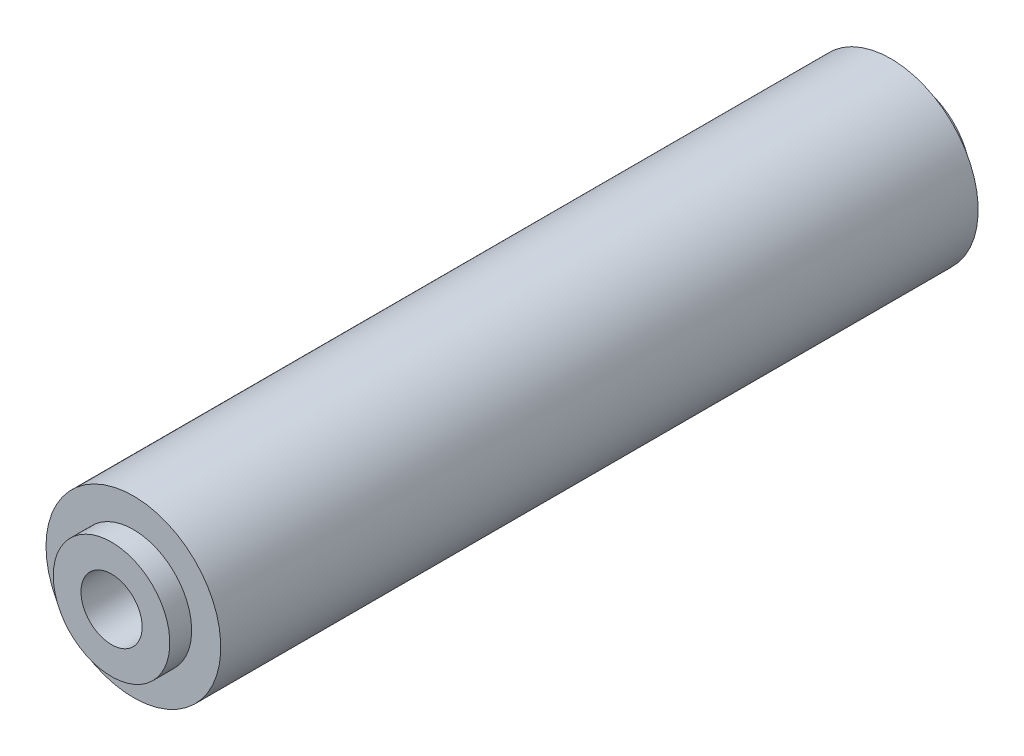
ISO-10303-21;
HEADER;
FILE_DESCRIPTION(('STEP AP214'),'2;1');
FILE_NAME('part.step','',(''),(''),'','','');
FILE_SCHEMA(('AUTOMOTIVE_DESIGN { 1 0 10303 214 1 1 1 1 }'));
ENDSEC;
DATA;
#1=APPLICATION_CONTEXT('core data for automotive mechanical design processes');
#2=APPLICATION_PROTOCOL_DEFINITION('international standard','automotive_design',2000,#1);
#3=PRODUCT_CONTEXT('',#1,'mechanical');
#4=PRODUCT('Part','Part','',(#3));
#5=PRODUCT_RELATED_PRODUCT_CATEGORY('part','',(#4));
#6=PRODUCT_DEFINITION_FORMATION('','',#4);
#7=PRODUCT_DEFINITION_CONTEXT('part definition',#1,'design');
#8=PRODUCT_DEFINITION('design','',#6,#7);
#9=PRODUCT_DEFINITION_SHAPE('','',#8);
#10=(LENGTH_UNIT() NAMED_UNIT(*) SI_UNIT(.MILLI.,.METRE.));
#11=(NAMED_UNIT(*) PLANE_ANGLE_UNIT() SI_UNIT($,.RADIAN.));
#12=(NAMED_UNIT(*) SI_UNIT($,.STERADIAN.) SOLID_ANGLE_UNIT());
#13=UNCERTAINTY_MEASURE_WITH_UNIT(LENGTH_MEASURE(1.E-05),#10,'distance_accuracy_value','');
#14=(GEOMETRIC_REPRESENTATION_CONTEXT(3) GLOBAL_UNCERTAINTY_ASSIGNED_CONTEXT((#13)) GLOBAL_UNIT_ASSIGNED_CONTEXT((#10,
#11,#12)) REPRESENTATION_CONTEXT('',''));
#15=CARTESIAN_POINT('',(0.,0.,0.));
#16=DIRECTION('',(0.,0.,1.));
#17=DIRECTION('',(1.,0.,0.));
#18=AXIS2_PLACEMENT_3D('',#15,#16,#17);
#19=CARTESIAN_POINT('',(0.,94.,-26.));
#20=DIRECTION('',(0.,0.,-1.));
#21=DIRECTION('',(-1.,0.,0.));
#22=AXIS2_PLACEMENT_3D('',#19,#20,#21);
#23=PLANE('',#22);
#24=CARTESIAN_POINT('',(0.,90.,-26.));
#25=DIRECTION('',(0.,0.,-1.));
#26=DIRECTION('',(-1.,0.,0.));
#27=AXIS2_PLACEMENT_3D('',#24,#25,#26);
#28=CIRCLE('',#27,5.99999999999999);
#29=CARTESIAN_POINT('',(-5.99999999999999,90.,-26.));
#30=VERTEX_POINT('',#29);
#31=EDGE_CURVE('E11',#30,#30,#28,.T.);
#32=ORIENTED_EDGE('',*,*,#31,.T.);
#33=EDGE_LOOP('',(#32));
#34=FACE_BOUND('',#33,.T.);
#35=CARTESIAN_POINT('',(0.,90.,-26.));
#36=DIRECTION('',(0.,0.,-1.));
#37=DIRECTION('',(-1.,0.,0.));
#38=AXIS2_PLACEMENT_3D('',#35,#36,#37);
#39=CIRCLE('',#38,4.);
#40=CARTESIAN_POINT('',(-4.,90.,-26.));
#41=VERTEX_POINT('',#40);
#42=EDGE_CURVE('E68',#41,#41,#39,.T.);
#43=ORIENTED_EDGE('',*,*,#42,.F.);
#44=EDGE_LOOP('',(#43));
#45=FACE_BOUND('',#44,.T.);
#46=ADVANCED_FACE('F34',(#34,#45),#23,.T.);
#47=CARTESIAN_POINT('',(0.,90.,-27.5));
#48=DIRECTION('',(0.,0.,-1.));
#49=DIRECTION('',(-1.,0.,0.));
#50=AXIS2_PLACEMENT_3D('',#47,#48,#49);
#51=CYLINDRICAL_SURFACE('',#50,6.00000000000001);
#52=CARTESIAN_POINT('',(0.,90.,26.));
#53=DIRECTION('',(0.,0.,-1.));
#54=DIRECTION('',(-1.,0.,0.));
#55=AXIS2_PLACEMENT_3D('',#52,#53,#54);
#56=CIRCLE('',#55,6.00000000000002);
#57=CARTESIAN_POINT('',(-6.00000000000002,90.,26.));
#58=VERTEX_POINT('',#57);
#59=EDGE_CURVE('E41',#58,#58,#56,.T.);
#60=ORIENTED_EDGE('',*,*,#59,.T.);
#61=EDGE_LOOP('',(#60));
#62=FACE_BOUND('',#61,.T.);
#63=ORIENTED_EDGE('',*,*,#31,.F.);
#64=EDGE_LOOP('',(#63));
#65=FACE_BOUND('',#64,.T.);
#66=ADVANCED_FACE('F82',(#62,#65),#51,.T.);
#67=CARTESIAN_POINT('',(0.,94.,26.));
#68=DIRECTION('',(0.,0.,1.));
#69=DIRECTION('',(1.,0.,0.));
#70=AXIS2_PLACEMENT_3D('',#67,#68,#69);
#71=PLANE('',#70);
#72=CARTESIAN_POINT('',(0.,90.,26.));
#73=DIRECTION('',(0.,0.,-1.));
#74=DIRECTION('',(-1.,0.,0.));
#75=AXIS2_PLACEMENT_3D('',#72,#73,#74);
#76=CIRCLE('',#75,4.);
#77=CARTESIAN_POINT('',(-4.,90.,26.));
#78=VERTEX_POINT('',#77);
#79=EDGE_CURVE('E77',#78,#78,#76,.T.);
#80=ORIENTED_EDGE('',*,*,#79,.T.);
#81=EDGE_LOOP('',(#80));
#82=FACE_BOUND('',#81,.T.);
#83=ORIENTED_EDGE('',*,*,#59,.F.);
#84=EDGE_LOOP('',(#83));
#85=FACE_BOUND('',#84,.T.);
#86=ADVANCED_FACE('F85',(#82,#85),#71,.T.);
#87=CARTESIAN_POINT('',(0.,90.,-27.5));
#88=DIRECTION('',(0.,0.,-1.));
#89=DIRECTION('',(-1.,0.,0.));
#90=AXIS2_PLACEMENT_3D('',#87,#88,#89);
#91=CYLINDRICAL_SURFACE('',#90,4.);
#92=CARTESIAN_POINT('',(0.,90.,27.5));
#93=DIRECTION('',(0.,0.,-1.));
#94=DIRECTION('',(-1.,0.,0.));
#95=AXIS2_PLACEMENT_3D('',#92,#93,#94);
#96=CIRCLE('',#95,4.);
#97=CARTESIAN_POINT('',(-4.,90.,27.5));
#98=VERTEX_POINT('',#97);
#99=EDGE_CURVE('E74',#98,#98,#96,.T.);
#100=ORIENTED_EDGE('',*,*,#99,.T.);
#101=EDGE_LOOP('',(#100));
#102=FACE_BOUND('',#101,.T.);
#103=ORIENTED_EDGE('',*,*,#79,.F.);
#104=EDGE_LOOP('',(#103));
#105=FACE_BOUND('',#104,.T.);
#106=ADVANCED_FACE('F87',(#102,#105),#91,.T.);
#107=CARTESIAN_POINT('',(0.,90.,27.5));
#108=DIRECTION('',(0.,0.,1.));
#109=DIRECTION('',(1.,0.,0.));
#110=AXIS2_PLACEMENT_3D('',#107,#108,#109);
#111=PLANE('',#110);
#112=CARTESIAN_POINT('',(0.,90.,27.5));
#113=DIRECTION('',(0.,0.,1.));
#114=DIRECTION('',(1.,0.,0.));
#115=AXIS2_PLACEMENT_3D('',#112,#113,#114);
#116=CIRCLE('',#115,2.1);
#117=CARTESIAN_POINT('',(2.1,90.,27.5));
#118=VERTEX_POINT('',#117);
#119=EDGE_CURVE('E57',#118,#118,#116,.T.);
#120=ORIENTED_EDGE('',*,*,#119,.F.);
#121=EDGE_LOOP('',(#120));
#122=FACE_BOUND('',#121,.T.);
#123=ORIENTED_EDGE('',*,*,#99,.F.);
#124=EDGE_LOOP('',(#123));
#125=FACE_BOUND('',#124,.T.);
#126=ADVANCED_FACE('F94',(#122,#125),#111,.T.);
#127=CARTESIAN_POINT('',(0.,94.,-27.5));
#128=DIRECTION('',(0.,0.,-1.));
#129=DIRECTION('',(-1.,0.,0.));
#130=AXIS2_PLACEMENT_3D('',#127,#128,#129);
#131=PLANE('',#130);
#132=CARTESIAN_POINT('',(0.,90.,-27.5));
#133=DIRECTION('',(0.,0.,-1.));
#134=DIRECTION('',(-1.,0.,0.));
#135=AXIS2_PLACEMENT_3D('',#132,#133,#134);
#136=CIRCLE('',#135,2.1);
#137=CARTESIAN_POINT('',(-2.1,90.,-27.5));
#138=VERTEX_POINT('',#137);
#139=EDGE_CURVE('E58',#138,#138,#136,.T.);
#140=ORIENTED_EDGE('',*,*,#139,.F.);
#141=EDGE_LOOP('',(#140));
#142=FACE_BOUND('',#141,.T.);
#143=CARTESIAN_POINT('',(0.,90.,-27.5));
#144=DIRECTION('',(0.,0.,-1.));
#145=DIRECTION('',(-1.,0.,0.));
#146=AXIS2_PLACEMENT_3D('',#143,#144,#145);
#147=CIRCLE('',#146,4.);
#148=CARTESIAN_POINT('',(-4.,90.,-27.5));
#149=VERTEX_POINT('',#148);
#150=EDGE_CURVE('E71',#149,#149,#147,.T.);
#151=ORIENTED_EDGE('',*,*,#150,.T.);
#152=EDGE_LOOP('',(#151));
#153=FACE_BOUND('',#152,.T.);
#154=ADVANCED_FACE('F109',(#142,#153),#131,.T.);
#155=CARTESIAN_POINT('',(0.,90.,-27.5));
#156=DIRECTION('',(0.,0.,-1.));
#157=DIRECTION('',(-1.,0.,0.));
#158=AXIS2_PLACEMENT_3D('',#155,#156,#157);
#159=CYLINDRICAL_SURFACE('',#158,4.);
#160=ORIENTED_EDGE('',*,*,#42,.T.);
#161=EDGE_LOOP('',(#160));
#162=FACE_BOUND('',#161,.T.);
#163=ORIENTED_EDGE('',*,*,#150,.F.);
#164=EDGE_LOOP('',(#163));
#165=FACE_BOUND('',#164,.T.);
#166=ADVANCED_FACE('F105',(#162,#165),#159,.T.);
#167=CARTESIAN_POINT('',(0.,90.,12.5));
#168=DIRECTION('',(0.,0.,1.));
#169=DIRECTION('',(1.,0.,0.));
#170=AXIS2_PLACEMENT_3D('',#167,#168,#169);
#171=CONICAL_SURFACE('',#170,2.1,1.02974425867665);
#172=CARTESIAN_POINT('',(0.,90.,11.2381927000421));
#173=VERTEX_POINT('',#172);
#174=VERTEX_LOOP('',#173);
#175=FACE_BOUND('',#174,.T.);
#176=CARTESIAN_POINT('',(0.,90.,12.5));
#177=DIRECTION('',(0.,0.,1.));
#178=DIRECTION('',(1.,0.,0.));
#179=AXIS2_PLACEMENT_3D('',#176,#177,#178);
#180=CIRCLE('',#179,2.1);
#181=CARTESIAN_POINT('',(2.1,90.,12.5));
#182=VERTEX_POINT('',#181);
#183=EDGE_CURVE('E61',#182,#182,#180,.T.);
#184=ORIENTED_EDGE('',*,*,#183,.T.);
#185=EDGE_LOOP('',(#184));
#186=FACE_BOUND('',#185,.T.);
#187=ADVANCED_FACE('F108',(#175,#186),#171,.F.);
#188=CARTESIAN_POINT('',(0.,90.,27.5));
#189=DIRECTION('',(0.,0.,1.));
#190=DIRECTION('',(1.,0.,0.));
#191=AXIS2_PLACEMENT_3D('',#188,#189,#190);
#192=CYLINDRICAL_SURFACE('',#191,2.1);
#193=ORIENTED_EDGE('',*,*,#183,.F.);
#194=EDGE_LOOP('',(#193));
#195=FACE_BOUND('',#194,.T.);
#196=ORIENTED_EDGE('',*,*,#119,.T.);
#197=EDGE_LOOP('',(#196));
#198=FACE_BOUND('',#197,.T.);
#199=ADVANCED_FACE('F51',(#195,#198),#192,.F.);
#200=CARTESIAN_POINT('',(0.,90.,-12.5));
#201=DIRECTION('',(0.,0.,-1.));
#202=DIRECTION('',(-1.,0.,0.));
#203=AXIS2_PLACEMENT_3D('',#200,#201,#202);
#204=CONICAL_SURFACE('',#203,2.1,1.02974425867665);
#205=CARTESIAN_POINT('',(0.,90.,-11.2381927000421));
#206=VERTEX_POINT('',#205);
#207=VERTEX_LOOP('',#206);
#208=FACE_BOUND('',#207,.T.);
#209=CARTESIAN_POINT('',(0.,90.,-12.5));
#210=DIRECTION('',(0.,0.,-1.));
#211=DIRECTION('',(-1.,0.,0.));
#212=AXIS2_PLACEMENT_3D('',#209,#210,#211);
#213=CIRCLE('',#212,2.1);
#214=CARTESIAN_POINT('',(-2.1,90.,-12.5));
#215=VERTEX_POINT('',#214);
#216=EDGE_CURVE('E55',#215,#215,#213,.T.);
#217=ORIENTED_EDGE('',*,*,#216,.T.);
#218=EDGE_LOOP('',(#217));
#219=FACE_BOUND('',#218,.T.);
#220=ADVANCED_FACE('F47',(#208,#219),#204,.F.);
#221=CARTESIAN_POINT('',(0.,90.,-27.5));
#222=DIRECTION('',(0.,0.,-1.));
#223=DIRECTION('',(-1.,0.,0.));
#224=AXIS2_PLACEMENT_3D('',#221,#222,#223);
#225=CYLINDRICAL_SURFACE('',#224,2.1);
#226=ORIENTED_EDGE('',*,*,#216,.F.);
#227=EDGE_LOOP('',(#226));
#228=FACE_BOUND('',#227,.T.);
#229=ORIENTED_EDGE('',*,*,#139,.T.);
#230=EDGE_LOOP('',(#229));
#231=FACE_BOUND('',#230,.T.);
#232=ADVANCED_FACE('F50',(#228,#231),#225,.F.);
#233=CLOSED_SHELL('',(#46,#66,#86,#106,#126,#154,#166,#187,#199,#220,#232));
#234=MANIFOLD_SOLID_BREP('B2',#233);
#235=ADVANCED_BREP_SHAPE_REPRESENTATION('',(#18,#234),#14);
#236=SHAPE_DEFINITION_REPRESENTATION(#9,#235);
ENDSEC;
END-ISO-10303-21;
